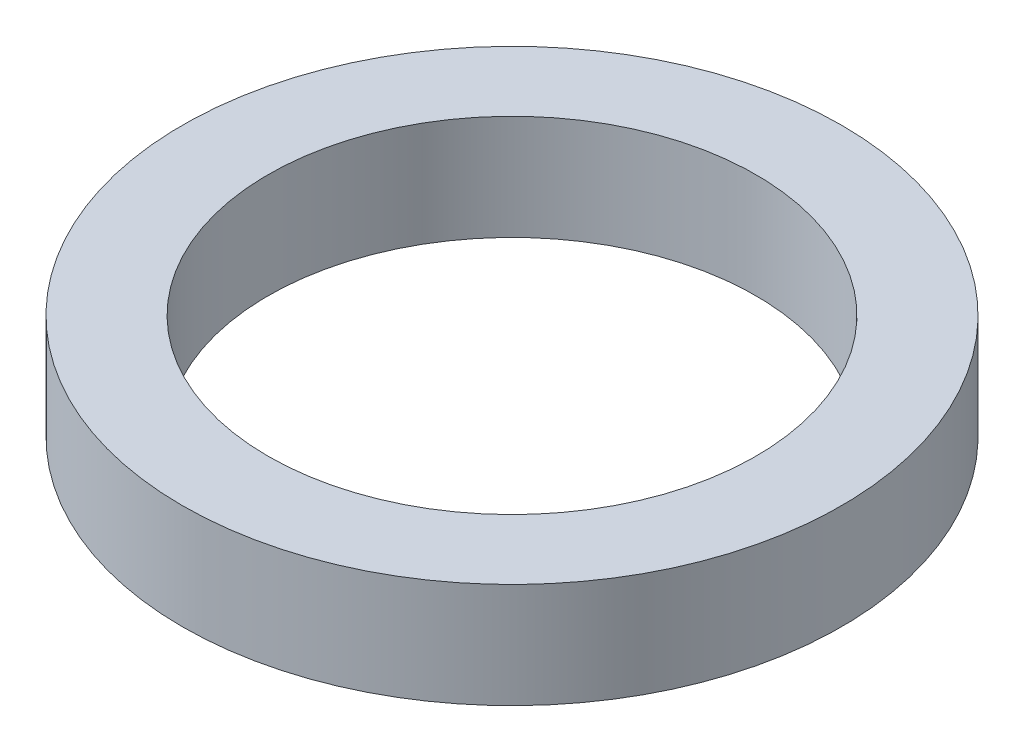
ISO-10303-21;
HEADER;
FILE_DESCRIPTION(('STEP AP214'),'2;1');
FILE_NAME('part.step','',(''),(''),'','','');
FILE_SCHEMA(('AUTOMOTIVE_DESIGN { 1 0 10303 214 1 1 1 1 }'));
ENDSEC;
DATA;
#1=APPLICATION_CONTEXT('core data for automotive mechanical design processes');
#2=APPLICATION_PROTOCOL_DEFINITION('international standard','automotive_design',2000,#1);
#3=PRODUCT_CONTEXT('',#1,'mechanical');
#4=PRODUCT('Part','Part','',(#3));
#5=PRODUCT_RELATED_PRODUCT_CATEGORY('part','',(#4));
#6=PRODUCT_DEFINITION_FORMATION('','',#4);
#7=PRODUCT_DEFINITION_CONTEXT('part definition',#1,'design');
#8=PRODUCT_DEFINITION('design','',#6,#7);
#9=PRODUCT_DEFINITION_SHAPE('','',#8);
#10=(LENGTH_UNIT() NAMED_UNIT(*) SI_UNIT(.MILLI.,.METRE.));
#11=(NAMED_UNIT(*) PLANE_ANGLE_UNIT() SI_UNIT($,.RADIAN.));
#12=(NAMED_UNIT(*) SI_UNIT($,.STERADIAN.) SOLID_ANGLE_UNIT());
#13=UNCERTAINTY_MEASURE_WITH_UNIT(LENGTH_MEASURE(1.E-05),#10,'distance_accuracy_value','');
#14=(GEOMETRIC_REPRESENTATION_CONTEXT(3) GLOBAL_UNCERTAINTY_ASSIGNED_CONTEXT((#13)) GLOBAL_UNIT_ASSIGNED_CONTEXT((#10,
#11,#12)) REPRESENTATION_CONTEXT('',''));
#15=CARTESIAN_POINT('',(0.,0.,0.));
#16=DIRECTION('',(0.,0.,1.));
#17=DIRECTION('',(1.,0.,0.));
#18=AXIS2_PLACEMENT_3D('',#15,#16,#17);
#19=CARTESIAN_POINT('',(0.,5.49,0.));
#20=DIRECTION('',(0.,-1.,0.));
#21=DIRECTION('',(0.,0.,-1.));
#22=AXIS2_PLACEMENT_3D('',#19,#20,#21);
#23=CYLINDRICAL_SURFACE('',#22,17.24);
#24=CARTESIAN_POINT('',(0.,5.49,0.));
#25=DIRECTION('',(0.,1.,0.));
#26=DIRECTION('',(0.,0.,1.));
#27=AXIS2_PLACEMENT_3D('',#24,#25,#26);
#28=CIRCLE('',#27,17.24);
#29=CARTESIAN_POINT('',(0.,5.49,17.24));
#30=VERTEX_POINT('',#29);
#31=EDGE_CURVE('E10',#30,#30,#28,.T.);
#32=ORIENTED_EDGE('',*,*,#31,.F.);
#33=EDGE_LOOP('',(#32));
#34=FACE_BOUND('',#33,.T.);
#35=CARTESIAN_POINT('',(0.,0.,0.));
#36=DIRECTION('',(0.,1.,0.));
#37=DIRECTION('',(0.,0.,1.));
#38=AXIS2_PLACEMENT_3D('',#35,#36,#37);
#39=CIRCLE('',#38,17.24);
#40=CARTESIAN_POINT('',(0.,0.,17.24));
#41=VERTEX_POINT('',#40);
#42=EDGE_CURVE('E37',#41,#41,#39,.T.);
#43=ORIENTED_EDGE('',*,*,#42,.T.);
#44=EDGE_LOOP('',(#43));
#45=FACE_BOUND('',#44,.T.);
#46=ADVANCED_FACE('F30',(#34,#45),#23,.T.);
#47=CARTESIAN_POINT('',(0.,5.49,0.));
#48=DIRECTION('',(0.,1.,0.));
#49=DIRECTION('',(0.,0.,1.));
#50=AXIS2_PLACEMENT_3D('',#47,#48,#49);
#51=PLANE('',#50);
#52=CARTESIAN_POINT('',(0.,5.49,0.));
#53=DIRECTION('',(0.,1.,0.));
#54=DIRECTION('',(0.,0.,1.));
#55=AXIS2_PLACEMENT_3D('',#52,#53,#54);
#56=CIRCLE('',#55,12.76);
#57=CARTESIAN_POINT('',(0.,5.49,12.76));
#58=VERTEX_POINT('',#57);
#59=EDGE_CURVE('E42',#58,#58,#56,.F.);
#60=ORIENTED_EDGE('',*,*,#59,.T.);
#61=EDGE_LOOP('',(#60));
#62=FACE_BOUND('',#61,.T.);
#63=ORIENTED_EDGE('',*,*,#31,.T.);
#64=EDGE_LOOP('',(#63));
#65=FACE_BOUND('',#64,.T.);
#66=ADVANCED_FACE('F55',(#62,#65),#51,.T.);
#67=CARTESIAN_POINT('',(0.,0.,0.));
#68=DIRECTION('',(0.,1.,0.));
#69=DIRECTION('',(0.,0.,1.));
#70=AXIS2_PLACEMENT_3D('',#67,#68,#69);
#71=PLANE('',#70);
#72=CARTESIAN_POINT('',(0.,0.,0.));
#73=DIRECTION('',(0.,1.,0.));
#74=DIRECTION('',(0.,0.,1.));
#75=AXIS2_PLACEMENT_3D('',#72,#73,#74);
#76=CIRCLE('',#75,12.76);
#77=CARTESIAN_POINT('',(0.,0.,12.76));
#78=VERTEX_POINT('',#77);
#79=EDGE_CURVE('E33',#78,#78,#76,.F.);
#80=ORIENTED_EDGE('',*,*,#79,.F.);
#81=EDGE_LOOP('',(#80));
#82=FACE_BOUND('',#81,.T.);
#83=ORIENTED_EDGE('',*,*,#42,.F.);
#84=EDGE_LOOP('',(#83));
#85=FACE_BOUND('',#84,.T.);
#86=ADVANCED_FACE('F52',(#82,#85),#71,.F.);
#87=CARTESIAN_POINT('',(0.,12.49,0.));
#88=DIRECTION('',(0.,-1.,0.));
#89=DIRECTION('',(0.,0.,-1.));
#90=AXIS2_PLACEMENT_3D('',#87,#88,#89);
#91=CYLINDRICAL_SURFACE('',#90,12.76);
#92=ORIENTED_EDGE('',*,*,#59,.F.);
#93=EDGE_LOOP('',(#92));
#94=FACE_BOUND('',#93,.T.);
#95=ORIENTED_EDGE('',*,*,#79,.T.);
#96=EDGE_LOOP('',(#95));
#97=FACE_BOUND('',#96,.T.);
#98=ADVANCED_FACE('F50',(#94,#97),#91,.F.);
#99=CLOSED_SHELL('',(#46,#66,#86,#98));
#100=MANIFOLD_SOLID_BREP('B2',#99);
#101=ADVANCED_BREP_SHAPE_REPRESENTATION('',(#18,#100),#14);
#102=SHAPE_DEFINITION_REPRESENTATION(#9,#101);
ENDSEC;
END-ISO-10303-21;
